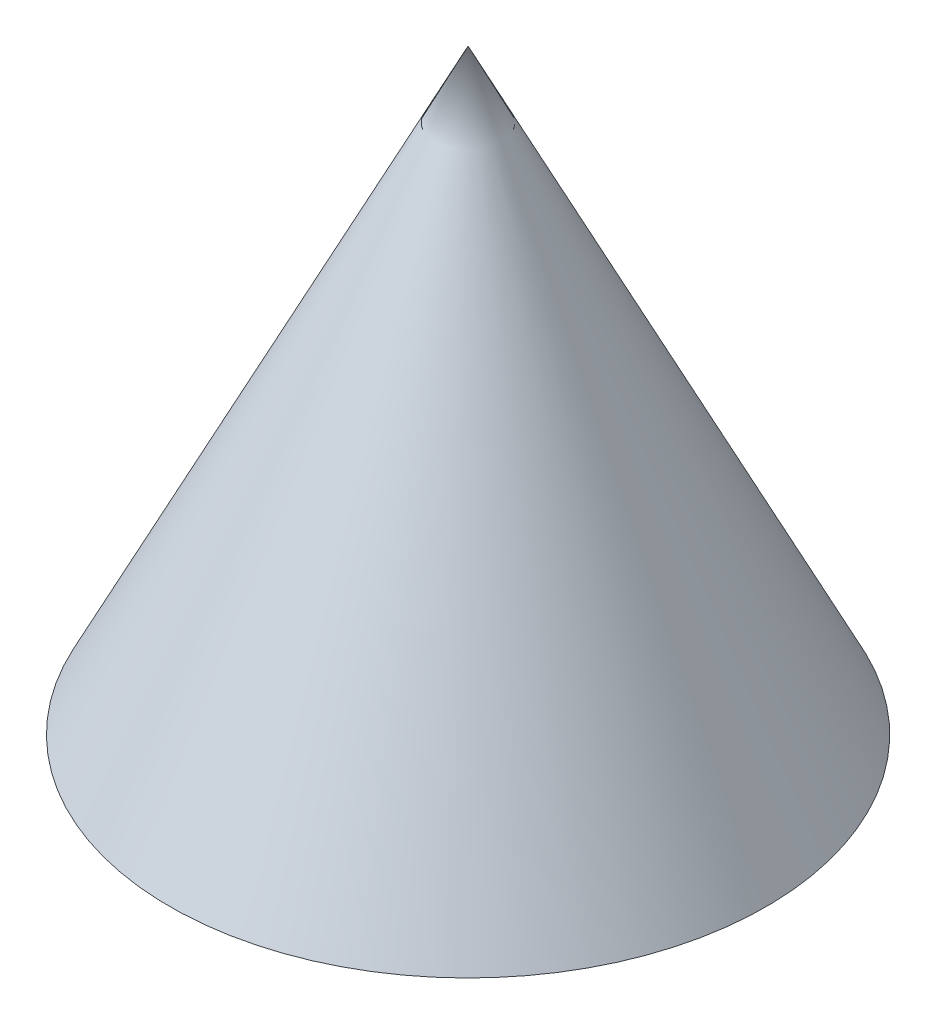
ISO-10303-21;
HEADER;
FILE_DESCRIPTION(('STEP AP214'),'2;1');
FILE_NAME('part.step','',(''),(''),'','','');
FILE_SCHEMA(('AUTOMOTIVE_DESIGN { 1 0 10303 214 1 1 1 1 }'));
ENDSEC;
DATA;
#1=APPLICATION_CONTEXT('core data for automotive mechanical design processes');
#2=APPLICATION_PROTOCOL_DEFINITION('international standard','automotive_design',2000,#1);
#3=PRODUCT_CONTEXT('',#1,'mechanical');
#4=PRODUCT('Part','Part','',(#3));
#5=PRODUCT_RELATED_PRODUCT_CATEGORY('part','',(#4));
#6=PRODUCT_DEFINITION_FORMATION('','',#4);
#7=PRODUCT_DEFINITION_CONTEXT('part definition',#1,'design');
#8=PRODUCT_DEFINITION('design','',#6,#7);
#9=PRODUCT_DEFINITION_SHAPE('','',#8);
#10=(LENGTH_UNIT() NAMED_UNIT(*) SI_UNIT(.MILLI.,.METRE.));
#11=(NAMED_UNIT(*) PLANE_ANGLE_UNIT() SI_UNIT($,.RADIAN.));
#12=(NAMED_UNIT(*) SI_UNIT($,.STERADIAN.) SOLID_ANGLE_UNIT());
#13=UNCERTAINTY_MEASURE_WITH_UNIT(LENGTH_MEASURE(1.E-05),#10,'distance_accuracy_value','');
#14=(GEOMETRIC_REPRESENTATION_CONTEXT(3) GLOBAL_UNCERTAINTY_ASSIGNED_CONTEXT((#13)) GLOBAL_UNIT_ASSIGNED_CONTEXT((#10,
#11,#12)) REPRESENTATION_CONTEXT('',''));
#15=CARTESIAN_POINT('',(0.,0.,0.));
#16=DIRECTION('',(0.,0.,1.));
#17=DIRECTION('',(1.,0.,0.));
#18=AXIS2_PLACEMENT_3D('',#15,#16,#17);
#19=CARTESIAN_POINT('',(127.,0.,0.));
#20=DIRECTION('',(0.,-1.,0.));
#21=DIRECTION('',(0.,0.,-1.));
#22=AXIS2_PLACEMENT_3D('',#19,#20,#21);
#23=PLANE('',#22);
#24=CARTESIAN_POINT('',(0.,0.,0.));
#25=DIRECTION('',(0.,-1.,0.));
#26=DIRECTION('',(0.,0.,-1.));
#27=AXIS2_PLACEMENT_3D('',#24,#25,#26);
#28=CIRCLE('',#27,127.);
#29=CARTESIAN_POINT('',(0.,0.,-127.));
#30=VERTEX_POINT('',#29);
#31=EDGE_CURVE('E11',#30,#30,#28,.T.);
#32=ORIENTED_EDGE('',*,*,#31,.T.);
#33=EDGE_LOOP('',(#32));
#34=FACE_BOUND('',#33,.T.);
#35=ADVANCED_FACE('F34',(#34),#23,.T.);
#36=CARTESIAN_POINT('',(0.,0.,0.));
#37=DIRECTION('',(0.,-1.,0.));
#38=DIRECTION('',(0.,0.,-1.));
#39=AXIS2_PLACEMENT_3D('',#36,#37,#38);
#40=CONICAL_SURFACE('',#39,127.,0.463647609000806);
#41=CARTESIAN_POINT('',(0.,254.,0.));
#42=VERTEX_POINT('',#41);
#43=VERTEX_LOOP('',#42);
#44=FACE_BOUND('',#43,.T.);
#45=ORIENTED_EDGE('',*,*,#31,.F.);
#46=EDGE_LOOP('',(#45));
#47=FACE_BOUND('',#46,.T.);
#48=ADVANCED_FACE('F41',(#44,#47),#40,.T.);
#49=CLOSED_SHELL('',(#35,#48));
#50=MANIFOLD_SOLID_BREP('B2',#49);
#51=ADVANCED_BREP_SHAPE_REPRESENTATION('',(#18,#50),#14);
#52=SHAPE_DEFINITION_REPRESENTATION(#9,#51);
ENDSEC;
END-ISO-10303-21;
